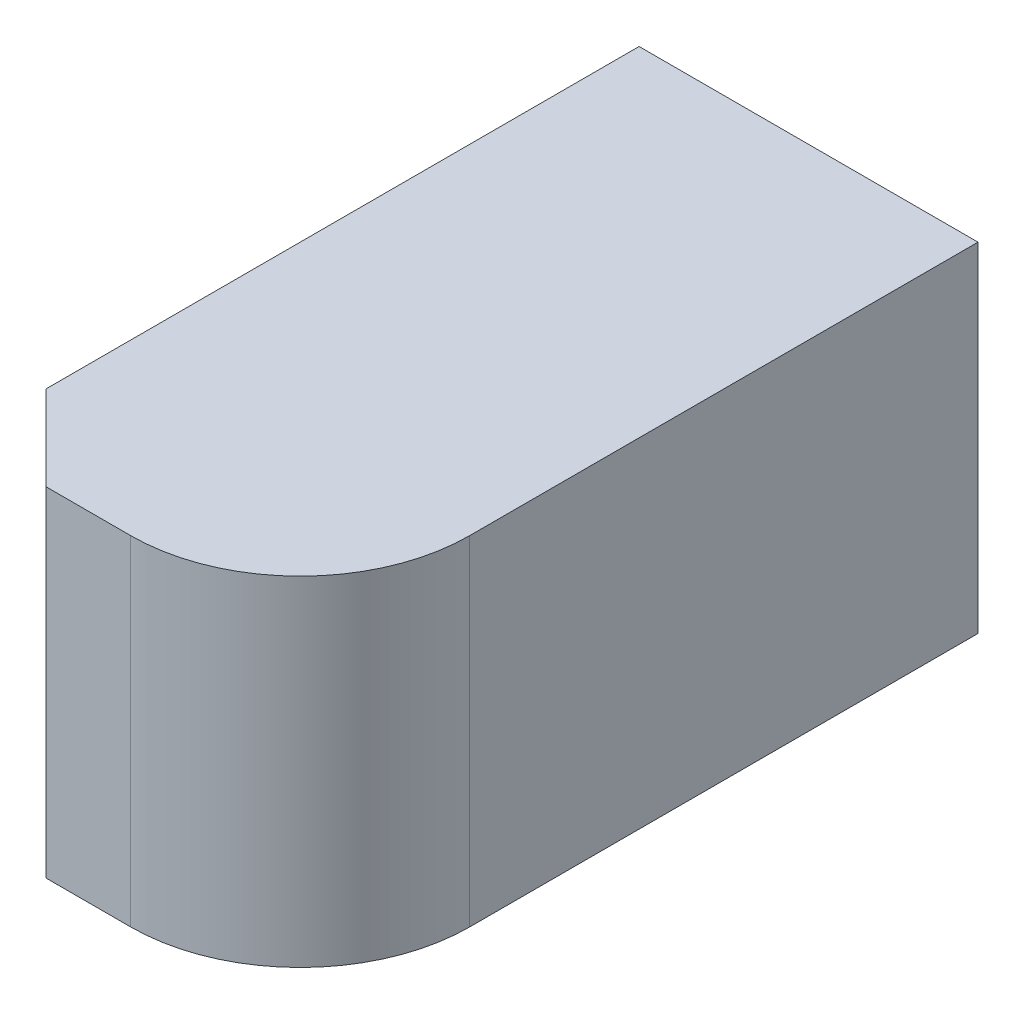
ISO-10303-21;
HEADER;
FILE_DESCRIPTION(('STEP AP214'),'2;1');
FILE_NAME('part.step','',(''),(''),'','','');
FILE_SCHEMA(('AUTOMOTIVE_DESIGN { 1 0 10303 214 1 1 1 1 }'));
ENDSEC;
DATA;
#1=APPLICATION_CONTEXT('core data for automotive mechanical design processes');
#2=APPLICATION_PROTOCOL_DEFINITION('international standard','automotive_design',2000,#1);
#3=PRODUCT_CONTEXT('',#1,'mechanical');
#4=PRODUCT('Part','Part','',(#3));
#5=PRODUCT_RELATED_PRODUCT_CATEGORY('part','',(#4));
#6=PRODUCT_DEFINITION_FORMATION('','',#4);
#7=PRODUCT_DEFINITION_CONTEXT('part definition',#1,'design');
#8=PRODUCT_DEFINITION('design','',#6,#7);
#9=PRODUCT_DEFINITION_SHAPE('','',#8);
#10=(LENGTH_UNIT() NAMED_UNIT(*) SI_UNIT(.MILLI.,.METRE.));
#11=(NAMED_UNIT(*) PLANE_ANGLE_UNIT() SI_UNIT($,.RADIAN.));
#12=(NAMED_UNIT(*) SI_UNIT($,.STERADIAN.) SOLID_ANGLE_UNIT());
#13=UNCERTAINTY_MEASURE_WITH_UNIT(LENGTH_MEASURE(1.E-05),#10,'distance_accuracy_value','');
#14=(GEOMETRIC_REPRESENTATION_CONTEXT(3) GLOBAL_UNCERTAINTY_ASSIGNED_CONTEXT((#13)) GLOBAL_UNIT_ASSIGNED_CONTEXT((#10,
#11,#12)) REPRESENTATION_CONTEXT('',''));
#15=CARTESIAN_POINT('',(0.,0.,0.));
#16=DIRECTION('',(0.,0.,1.));
#17=DIRECTION('',(1.,0.,0.));
#18=AXIS2_PLACEMENT_3D('',#15,#16,#17);
#19=CARTESIAN_POINT('',(0.,20.,0.));
#20=DIRECTION('',(1.,0.,0.));
#21=DIRECTION('',(0.,0.,-1.));
#22=AXIS2_PLACEMENT_3D('',#19,#20,#21);
#23=PLANE('',#22);
#24=DIRECTION('',(0.,0.,1.));
#25=VECTOR('',#24,1.);
#26=CARTESIAN_POINT('',(0.,0.,0.));
#27=LINE('',#26,#25);
#28=CARTESIAN_POINT('',(0.,0.,-40.));
#29=VERTEX_POINT('',#28);
#30=CARTESIAN_POINT('',(0.,0.,-5.));
#31=VERTEX_POINT('',#30);
#32=EDGE_CURVE('E125',#29,#31,#27,.T.);
#33=ORIENTED_EDGE('',*,*,#32,.T.);
#34=DIRECTION('',(0.,1.,0.));
#35=VECTOR('',#34,1.);
#36=CARTESIAN_POINT('',(0.,20.,-5.));
#37=LINE('',#36,#35);
#38=CARTESIAN_POINT('',(0.,20.,-5.));
#39=VERTEX_POINT('',#38);
#40=EDGE_CURVE('E48',#31,#39,#37,.T.);
#41=ORIENTED_EDGE('',*,*,#40,.T.);
#42=DIRECTION('',(0.,0.,1.));
#43=VECTOR('',#42,1.);
#44=CARTESIAN_POINT('',(0.,20.,0.));
#45=LINE('',#44,#43);
#46=CARTESIAN_POINT('',(0.,20.,-40.));
#47=VERTEX_POINT('',#46);
#48=EDGE_CURVE('E135',#47,#39,#45,.T.);
#49=ORIENTED_EDGE('',*,*,#48,.F.);
#50=DIRECTION('',(0.,-1.,0.));
#51=VECTOR('',#50,1.);
#52=CARTESIAN_POINT('',(0.,20.,-40.));
#53=LINE('',#52,#51);
#54=EDGE_CURVE('E115',#47,#29,#53,.T.);
#55=ORIENTED_EDGE('',*,*,#54,.T.);
#56=EDGE_LOOP('',(#33,#41,#49,#55));
#57=FACE_BOUND('',#56,.T.);
#58=ADVANCED_FACE('F39',(#57),#23,.F.);
#59=CARTESIAN_POINT('',(0.,20.,0.));
#60=DIRECTION('',(0.,0.,-1.));
#61=DIRECTION('',(-1.,0.,0.));
#62=AXIS2_PLACEMENT_3D('',#59,#60,#61);
#63=PLANE('',#62);
#64=DIRECTION('',(1.,0.,0.));
#65=VECTOR('',#64,1.);
#66=CARTESIAN_POINT('',(0.,20.,0.));
#67=LINE('',#66,#65);
#68=CARTESIAN_POINT('',(4.99999999999999,20.,0.));
#69=VERTEX_POINT('',#68);
#70=CARTESIAN_POINT('',(10.,20.,0.));
#71=VERTEX_POINT('',#70);
#72=EDGE_CURVE('E104',#69,#71,#67,.T.);
#73=ORIENTED_EDGE('',*,*,#72,.F.);
#74=DIRECTION('',(0.,-1.,0.));
#75=VECTOR('',#74,1.);
#76=CARTESIAN_POINT('',(4.99999999999999,20.,0.));
#77=LINE('',#76,#75);
#78=CARTESIAN_POINT('',(4.99999999999999,0.,0.));
#79=VERTEX_POINT('',#78);
#80=EDGE_CURVE('E149',#69,#79,#77,.T.);
#81=ORIENTED_EDGE('',*,*,#80,.T.);
#82=DIRECTION('',(1.,0.,0.));
#83=VECTOR('',#82,1.);
#84=CARTESIAN_POINT('',(0.,0.,0.));
#85=LINE('',#84,#83);
#86=CARTESIAN_POINT('',(10.,0.,0.));
#87=VERTEX_POINT('',#86);
#88=EDGE_CURVE('E128',#79,#87,#85,.T.);
#89=ORIENTED_EDGE('',*,*,#88,.T.);
#90=DIRECTION('',(0.,-1.,0.));
#91=VECTOR('',#90,1.);
#92=CARTESIAN_POINT('',(10.,20.,0.));
#93=LINE('',#92,#91);
#94=EDGE_CURVE('E143',#87,#71,#93,.F.);
#95=ORIENTED_EDGE('',*,*,#94,.T.);
#96=EDGE_LOOP('',(#73,#81,#89,#95));
#97=FACE_BOUND('',#96,.T.);
#98=ADVANCED_FACE('F158',(#97),#63,.F.);
#99=CARTESIAN_POINT('',(20.,20.,0.));
#100=DIRECTION('',(-1.,0.,0.));
#101=DIRECTION('',(0.,0.,1.));
#102=AXIS2_PLACEMENT_3D('',#99,#100,#101);
#103=PLANE('',#102);
#104=DIRECTION('',(0.,0.,-1.));
#105=VECTOR('',#104,1.);
#106=CARTESIAN_POINT('',(20.,20.,0.));
#107=LINE('',#106,#105);
#108=CARTESIAN_POINT('',(20.,20.,-10.));
#109=VERTEX_POINT('',#108);
#110=CARTESIAN_POINT('',(20.,20.,-40.));
#111=VERTEX_POINT('',#110);
#112=EDGE_CURVE('E92',#109,#111,#107,.T.);
#113=ORIENTED_EDGE('',*,*,#112,.F.);
#114=DIRECTION('',(0.,-1.,0.));
#115=VECTOR('',#114,1.);
#116=CARTESIAN_POINT('',(20.,20.,-10.));
#117=LINE('',#116,#115);
#118=CARTESIAN_POINT('',(20.,0.,-10.));
#119=VERTEX_POINT('',#118);
#120=EDGE_CURVE('E114',#109,#119,#117,.T.);
#121=ORIENTED_EDGE('',*,*,#120,.T.);
#122=DIRECTION('',(0.,0.,-1.));
#123=VECTOR('',#122,1.);
#124=CARTESIAN_POINT('',(20.,0.,0.));
#125=LINE('',#124,#123);
#126=CARTESIAN_POINT('',(20.,0.,-40.));
#127=VERTEX_POINT('',#126);
#128=EDGE_CURVE('E110',#119,#127,#125,.T.);
#129=ORIENTED_EDGE('',*,*,#128,.T.);
#130=DIRECTION('',(0.,-1.,0.));
#131=VECTOR('',#130,1.);
#132=CARTESIAN_POINT('',(20.,20.,-40.));
#133=LINE('',#132,#131);
#134=EDGE_CURVE('E107',#111,#127,#133,.T.);
#135=ORIENTED_EDGE('',*,*,#134,.F.);
#136=EDGE_LOOP('',(#113,#121,#129,#135));
#137=FACE_BOUND('',#136,.T.);
#138=ADVANCED_FACE('F108',(#137),#103,.F.);
#139=CARTESIAN_POINT('',(0.,20.,-40.));
#140=DIRECTION('',(0.,0.,1.));
#141=DIRECTION('',(1.,0.,0.));
#142=AXIS2_PLACEMENT_3D('',#139,#140,#141);
#143=PLANE('',#142);
#144=DIRECTION('',(-1.,0.,0.));
#145=VECTOR('',#144,1.);
#146=CARTESIAN_POINT('',(0.,0.,-40.));
#147=LINE('',#146,#145);
#148=EDGE_CURVE('E133',#127,#29,#147,.T.);
#149=ORIENTED_EDGE('',*,*,#148,.T.);
#150=ORIENTED_EDGE('',*,*,#54,.F.);
#151=DIRECTION('',(-1.,0.,0.));
#152=VECTOR('',#151,1.);
#153=CARTESIAN_POINT('',(0.,20.,-40.));
#154=LINE('',#153,#152);
#155=EDGE_CURVE('E96',#111,#47,#154,.T.);
#156=ORIENTED_EDGE('',*,*,#155,.F.);
#157=ORIENTED_EDGE('',*,*,#134,.T.);
#158=EDGE_LOOP('',(#149,#150,#156,#157));
#159=FACE_BOUND('',#158,.T.);
#160=ADVANCED_FACE('F117',(#159),#143,.F.);
#161=CARTESIAN_POINT('',(0.,20.,0.));
#162=DIRECTION('',(0.,-1.,0.));
#163=DIRECTION('',(0.,0.,-1.));
#164=AXIS2_PLACEMENT_3D('',#161,#162,#163);
#165=PLANE('',#164);
#166=ORIENTED_EDGE('',*,*,#48,.T.);
#167=DIRECTION('',(-0.707106781186547,0.,-0.707106781186549));
#168=VECTOR('',#167,1.);
#169=CARTESIAN_POINT('',(4.99999999999999,20.,0.));
#170=LINE('',#169,#168);
#171=EDGE_CURVE('E11',#39,#69,#170,.F.);
#172=ORIENTED_EDGE('',*,*,#171,.T.);
#173=ORIENTED_EDGE('',*,*,#72,.T.);
#174=CARTESIAN_POINT('',(10.,20.,-10.));
#175=DIRECTION('',(0.,-1.,0.));
#176=DIRECTION('',(0.,0.,-1.));
#177=AXIS2_PLACEMENT_3D('',#174,#175,#176);
#178=CIRCLE('',#177,10.);
#179=EDGE_CURVE('E99',#71,#109,#178,.F.);
#180=ORIENTED_EDGE('',*,*,#179,.T.);
#181=ORIENTED_EDGE('',*,*,#112,.T.);
#182=ORIENTED_EDGE('',*,*,#155,.T.);
#183=EDGE_LOOP('',(#166,#172,#173,#180,#181,#182));
#184=FACE_BOUND('',#183,.T.);
#185=ADVANCED_FACE('F94',(#184),#165,.F.);
#186=CARTESIAN_POINT('',(0.,0.,0.));
#187=DIRECTION('',(0.,-1.,0.));
#188=DIRECTION('',(0.,0.,-1.));
#189=AXIS2_PLACEMENT_3D('',#186,#187,#188);
#190=PLANE('',#189);
#191=ORIENTED_EDGE('',*,*,#88,.F.);
#192=DIRECTION('',(0.707106781186547,0.,0.707106781186549));
#193=VECTOR('',#192,1.);
#194=CARTESIAN_POINT('',(2.5,0.,-2.49999999999999));
#195=LINE('',#194,#193);
#196=EDGE_CURVE('E62',#79,#31,#195,.F.);
#197=ORIENTED_EDGE('',*,*,#196,.T.);
#198=ORIENTED_EDGE('',*,*,#32,.F.);
#199=ORIENTED_EDGE('',*,*,#148,.F.);
#200=ORIENTED_EDGE('',*,*,#128,.F.);
#201=CARTESIAN_POINT('',(10.,0.,-10.));
#202=DIRECTION('',(0.,-1.,0.));
#203=DIRECTION('',(0.,0.,-1.));
#204=AXIS2_PLACEMENT_3D('',#201,#202,#203);
#205=CIRCLE('',#204,10.);
#206=EDGE_CURVE('E139',#119,#87,#205,.T.);
#207=ORIENTED_EDGE('',*,*,#206,.T.);
#208=EDGE_LOOP('',(#191,#197,#198,#199,#200,#207));
#209=FACE_BOUND('',#208,.T.);
#210=ADVANCED_FACE('F161',(#209),#190,.T.);
#211=CARTESIAN_POINT('',(10.,20.,-10.));
#212=DIRECTION('',(0.,-1.,0.));
#213=DIRECTION('',(0.,0.,-1.));
#214=AXIS2_PLACEMENT_3D('',#211,#212,#213);
#215=CYLINDRICAL_SURFACE('',#214,10.);
#216=ORIENTED_EDGE('',*,*,#179,.F.);
#217=ORIENTED_EDGE('',*,*,#94,.F.);
#218=ORIENTED_EDGE('',*,*,#206,.F.);
#219=ORIENTED_EDGE('',*,*,#120,.F.);
#220=EDGE_LOOP('',(#216,#217,#218,#219));
#221=FACE_BOUND('',#220,.T.);
#222=ADVANCED_FACE('F164',(#221),#215,.T.);
#223=CARTESIAN_POINT('',(4.99999999999999,20.,0.));
#224=DIRECTION('',(0.707106781186548,0.,-0.707106781186546));
#225=DIRECTION('',(0.,-1.,0.));
#226=AXIS2_PLACEMENT_3D('',#223,#224,#225);
#227=PLANE('',#226);
#228=ORIENTED_EDGE('',*,*,#171,.F.);
#229=ORIENTED_EDGE('',*,*,#40,.F.);
#230=ORIENTED_EDGE('',*,*,#196,.F.);
#231=ORIENTED_EDGE('',*,*,#80,.F.);
#232=EDGE_LOOP('',(#228,#229,#230,#231));
#233=FACE_BOUND('',#232,.T.);
#234=ADVANCED_FACE('F41',(#233),#227,.F.);
#235=CLOSED_SHELL('',(#58,#98,#138,#160,#185,#210,#222,#234));
#236=MANIFOLD_SOLID_BREP('B2',#235);
#237=ADVANCED_BREP_SHAPE_REPRESENTATION('',(#18,#236),#14);
#238=SHAPE_DEFINITION_REPRESENTATION(#9,#237);
ENDSEC;
END-ISO-10303-21;
